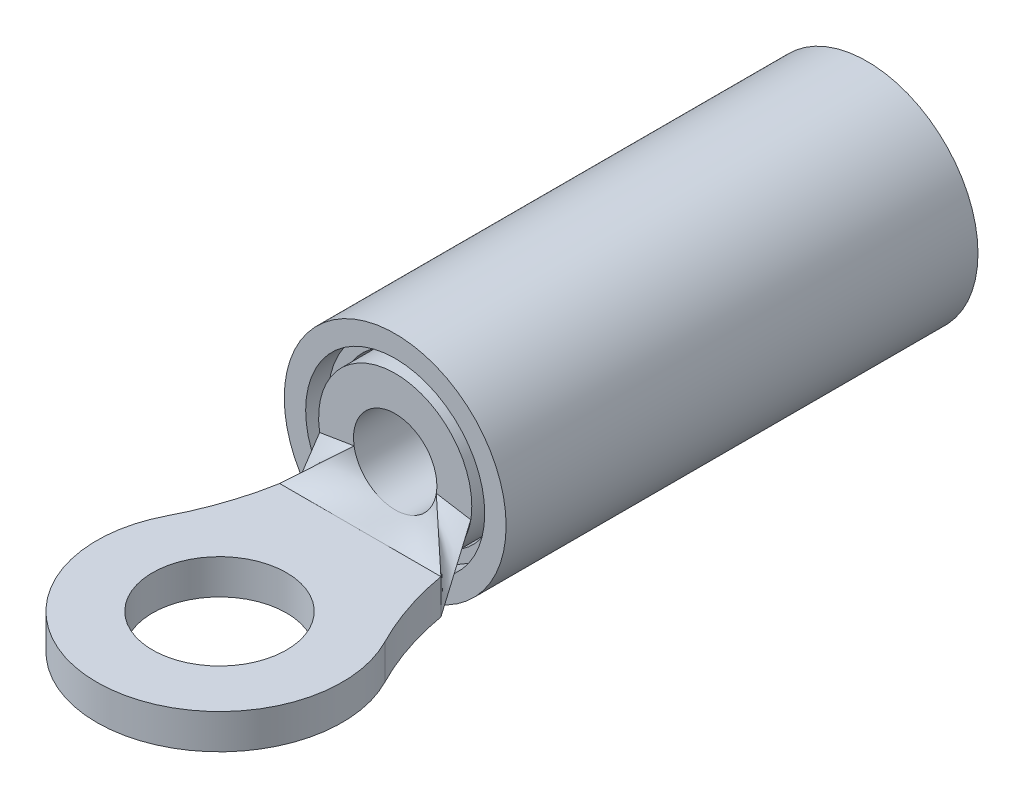
ISO-10303-21;
HEADER;
FILE_DESCRIPTION(('STEP AP214'),'2;1');
FILE_NAME('part.step','',(''),(''),'','','');
FILE_SCHEMA(('AUTOMOTIVE_DESIGN { 1 0 10303 214 1 1 1 1 }'));
ENDSEC;
DATA;
#1=APPLICATION_CONTEXT('core data for automotive mechanical design processes');
#2=APPLICATION_PROTOCOL_DEFINITION('international standard','automotive_design',2000,#1);
#3=PRODUCT_CONTEXT('',#1,'mechanical');
#4=PRODUCT('Part','Part','',(#3));
#5=PRODUCT_RELATED_PRODUCT_CATEGORY('part','',(#4));
#6=PRODUCT_DEFINITION_FORMATION('','',#4);
#7=PRODUCT_DEFINITION_CONTEXT('part definition',#1,'design');
#8=PRODUCT_DEFINITION('design','',#6,#7);
#9=PRODUCT_DEFINITION_SHAPE('','',#8);
#10=(LENGTH_UNIT() NAMED_UNIT(*) SI_UNIT(.MILLI.,.METRE.));
#11=(NAMED_UNIT(*) PLANE_ANGLE_UNIT() SI_UNIT($,.RADIAN.));
#12=(NAMED_UNIT(*) SI_UNIT($,.STERADIAN.) SOLID_ANGLE_UNIT());
#13=UNCERTAINTY_MEASURE_WITH_UNIT(LENGTH_MEASURE(1.E-05),#10,'distance_accuracy_value','');
#14=(GEOMETRIC_REPRESENTATION_CONTEXT(3) GLOBAL_UNCERTAINTY_ASSIGNED_CONTEXT((#13)) GLOBAL_UNIT_ASSIGNED_CONTEXT((#10,
#11,#12)) REPRESENTATION_CONTEXT('',''));
#15=CARTESIAN_POINT('',(0.,0.,0.));
#16=DIRECTION('',(0.,0.,1.));
#17=DIRECTION('',(1.,0.,0.));
#18=AXIS2_PLACEMENT_3D('',#15,#16,#17);
#19=CARTESIAN_POINT('',(0.,1.7272,-8.1026));
#20=DIRECTION('',(0.,0.,-1.));
#21=DIRECTION('',(-1.,0.,0.));
#22=AXIS2_PLACEMENT_3D('',#19,#20,#21);
#23=PLANE('',#22);
#24=CARTESIAN_POINT('',(0.,1.7272,-8.1026));
#25=DIRECTION('',(0.,0.,1.));
#26=DIRECTION('',(1.,0.,0.));
#27=AXIS2_PLACEMENT_3D('',#24,#25,#26);
#28=CIRCLE('',#27,0.9398);
#29=CARTESIAN_POINT('',(0.9398,1.7272,-8.1026));
#30=VERTEX_POINT('',#29);
#31=EDGE_CURVE('E118',#30,#30,#28,.T.);
#32=ORIENTED_EDGE('',*,*,#31,.T.);
#33=EDGE_LOOP('',(#32));
#34=FACE_BOUND('',#33,.T.);
#35=ADVANCED_FACE('F16',(#34),#23,.F.);
#36=CARTESIAN_POINT('',(0.,1.7272,-3.75539));
#37=DIRECTION('',(0.,0.,1.));
#38=DIRECTION('',(1.,0.,0.));
#39=AXIS2_PLACEMENT_3D('',#36,#37,#38);
#40=CYLINDRICAL_SURFACE('',#39,0.9398);
#41=ORIENTED_EDGE('',*,*,#31,.F.);
#42=EDGE_LOOP('',(#41));
#43=FACE_BOUND('',#42,.T.);
#44=CARTESIAN_POINT('',(0.927849603691904,1.57779473306881,-3.96239999999999));
#45=CARTESIAN_POINT('',(0.927688379855311,1.5767962073593,-3.96239999999999));
#46=CARTESIAN_POINT('',(0.892013020871429,1.35816828363591,-3.96239999999999));
#47=CARTESIAN_POINT('',(0.660693798805449,0.949289492115093,-3.96239999999999));
#48=CARTESIAN_POINT('',(0.,0.706455253942457,-3.96239999999999));
#49=CARTESIAN_POINT('',(-0.660693798805449,0.949289492115093,-3.96239999999999));
#50=CARTESIAN_POINT('',(-0.892013020871412,1.35816828363588,-3.96239999999999));
#51=CARTESIAN_POINT('',(-0.927688379855301,1.57679620735924,-3.96239999999999));
#52=CARTESIAN_POINT('',(-0.927849603691889,1.57779473306872,-3.96239999999999));
#53=B_SPLINE_CURVE_WITH_KNOTS('',3,(#44,#45,#46,#47,#48,#49,#50,#51,#52),.UNSPECIFIED.,.F.,.F.,
(4,1,1,1,1,1,4),(-0.00114672630853119,0.,0.250000000000036,0.500000000000036,0.750000000000036,
1.00000000000004,1.00114672630857),.UNSPECIFIED.);
#54=CARTESIAN_POINT('',(0.927360922187214,1.57480000000028,-3.9624));
#55=VERTEX_POINT('',#54);
#56=CARTESIAN_POINT('',(0.,0.787400000000001,-3.9624));
#57=VERTEX_POINT('',#56);
#58=EDGE_CURVE('E126',#55,#57,#53,.T.);
#59=ORIENTED_EDGE('',*,*,#58,.F.);
#60=CARTESIAN_POINT('',(0.,1.7272,-3.9624));
#61=DIRECTION('',(0.,0.,1.));
#62=DIRECTION('',(1.,0.,0.));
#63=AXIS2_PLACEMENT_3D('',#60,#61,#62);
#64=CIRCLE('',#63,0.9398);
#65=CARTESIAN_POINT('',(-0.927360922187283,1.57480000000009,-3.96239999999992));
#66=VERTEX_POINT('',#65);
#67=EDGE_CURVE('E123',#66,#55,#64,.F.);
#68=ORIENTED_EDGE('',*,*,#67,.F.);
#69=CARTESIAN_POINT('',(0.927849603691892,1.57779473306882,-3.9624));
#70=CARTESIAN_POINT('',(0.927688379855299,1.57679620735931,-3.9624));
#71=CARTESIAN_POINT('',(0.89201302087142,1.35816828363592,-3.9624));
#72=CARTESIAN_POINT('',(0.660693798805446,0.949289492115095,-3.9624));
#73=CARTESIAN_POINT('',(0.,0.706455253942456,-3.9624));
#74=CARTESIAN_POINT('',(-0.660693798805446,0.949289492115095,-3.9624));
#75=CARTESIAN_POINT('',(-0.892013020871404,1.35816828363589,-3.9624));
#76=CARTESIAN_POINT('',(-0.927688379855289,1.57679620735925,-3.9624));
#77=CARTESIAN_POINT('',(-0.927849603691877,1.57779473306873,-3.9624));
#78=B_SPLINE_CURVE_WITH_KNOTS('',3,(#69,#70,#71,#72,#73,#74,#75,#76,#77),.UNSPECIFIED.,.F.,.F.,
(4,1,1,1,1,1,4),(-0.00114672630853119,0.,0.250000000000036,0.500000000000036,0.750000000000036,
1.00000000000004,1.00114672630857),.UNSPECIFIED.);
#79=EDGE_CURVE('E226',#57,#66,#78,.T.);
#80=ORIENTED_EDGE('',*,*,#79,.F.);
#81=EDGE_LOOP('',(#59,#68,#80));
#82=FACE_BOUND('',#81,.T.);
#83=ADVANCED_FACE('F253',(#43,#82),#40,.F.);
#84=CARTESIAN_POINT('',(-1.82360988331871,0.786493633565488,-3.17409706770464));
#85=CARTESIAN_POINT('',(-1.52481400115551,1.05044540220337,-3.43704874732687));
#86=CARTESIAN_POINT('',(-1.2260181189923,1.31439717084039,-3.70000042695));
#87=CARTESIAN_POINT('',(-0.927222236829129,1.57834893947816,-3.96295210657224));
#88=CARTESIAN_POINT('',(-1.82221832573738,0.786494778601189,-3.17409706770464));
#89=CARTESIAN_POINT('',(-1.52383284205352,1.05011309027634,-3.43704874732687));
#90=CARTESIAN_POINT('',(-1.22544735836966,1.31373140195064,-3.70000042695));
#91=CARTESIAN_POINT('',(-0.92706187468583,1.57734971362567,-3.96295210657224));
#92=CARTESIAN_POINT('',(-1.5174510522353,0.786745484993033,-3.17409706770464));
#93=CARTESIAN_POINT('',(-1.30882569501637,0.977353154357277,-3.43704874732687));
#94=CARTESIAN_POINT('',(-1.10020033779743,1.16796082372152,-3.70000042695));
#95=CARTESIAN_POINT('',(-0.891574980578142,1.35856849308549,-3.96295210657224));
#96=CARTESIAN_POINT('',(-0.909491687782543,0.787214357060318,-3.17409706770464));
#97=CARTESIAN_POINT('',(-0.826500974298133,0.841277239794508,-3.43704874732687));
#98=CARTESIAN_POINT('',(-0.743510260813634,0.895340122528698,-3.70000042695));
#99=CARTESIAN_POINT('',(-0.660519547329224,0.949403005262888,-3.96295210657224));
#100=CARTESIAN_POINT('',(0.,0.787492821469888,-3.17409706770464));
#101=CARTESIAN_POINT('',(0.,0.760461380102748,-3.43704874732687));
#102=CARTESIAN_POINT('',(0.,0.733429938735698,-3.70000042695));
#103=CARTESIAN_POINT('',(0.,0.706398497368559,-3.96295210657224));
#104=CARTESIAN_POINT('',(0.909491687782543,0.787214357060318,-3.17409706770464));
#105=CARTESIAN_POINT('',(0.826500974298133,0.841277239794508,-3.43704874732687));
#106=CARTESIAN_POINT('',(0.743510260813634,0.895340122528698,-3.70000042695));
#107=CARTESIAN_POINT('',(0.660519547329224,0.949403005262888,-3.96295210657224));
#108=CARTESIAN_POINT('',(1.51745105223535,0.786745484993033,-3.17409706770464));
#109=CARTESIAN_POINT('',(1.30882569501641,0.977353154357287,-3.43704874732687));
#110=CARTESIAN_POINT('',(1.10020033779746,1.16796082372153,-3.70000042695));
#111=CARTESIAN_POINT('',(0.891574980578158,1.35856849308552,-3.96295210657224));
#112=CARTESIAN_POINT('',(1.82221832573746,0.786494778601189,-3.17409706770464));
#113=CARTESIAN_POINT('',(1.52383284205358,1.05011309027636,-3.43704874732687));
#114=CARTESIAN_POINT('',(1.22544735836969,1.31373140195068,-3.70000042695));
#115=CARTESIAN_POINT('',(0.927061874685841,1.57734971362574,-3.96295210657224));
#116=CARTESIAN_POINT('',(1.82360988331884,0.786493633565488,-3.17409706770464));
#117=CARTESIAN_POINT('',(1.5248140011556,1.0504454022034,-3.43704874732687));
#118=CARTESIAN_POINT('',(1.22601811899235,1.31439717084046,-3.70000042695));
#119=CARTESIAN_POINT('',(0.927222236829145,1.57834893947825,-3.96295210657224));
#120=B_SPLINE_SURFACE_WITH_KNOTS('',3,3,((#84,#85,#86,#87),(#88,#89,#90,#91),(#92,#93,#94,#95),
(#96,#97,#98,#99),(#100,#101,#102,#103),(#104,#105,#106,#107),(#108,#109,#110,#111),(#112,#113,
#114,#115),(#116,#117,#118,#119)),.UNSPECIFIED.,.F.,.F.,.F.,(4,1,1,1,1,1,4),(4,4),
(-0.0011467263085312,0.,0.25,0.5,0.75,1.,1.00114672630857),(-0.00114672630853697,
1.00070117674907),.UNSPECIFIED.);
#121=DIRECTION('',(-0.624785295765188,-0.552106572229049,0.552106572227768));
#122=VECTOR('',#121,1.);
#123=CARTESIAN_POINT('',(-1.37308567660576,1.18092458713851,-3.56852458713844));
#124=LINE('',#123,#122);
#125=CARTESIAN_POINT('',(-1.81841342297472,0.7874,-3.1750000000004));
#126=VERTEX_POINT('',#125);
#127=EDGE_CURVE('E80',#66,#126,#124,.T.);
#128=DIRECTION('',(1.,0.,0.));
#129=VECTOR('',#128,1.);
#130=CARTESIAN_POINT('',(0.,0.7874,-3.175));
#131=LINE('',#130,#129);
#132=CARTESIAN_POINT('',(1.81841342297489,0.787399999999682,-3.17500000000051));
#133=VERTEX_POINT('',#132);
#134=EDGE_CURVE('E93',#133,#126,#131,.F.);
#135=DIRECTION('',(-0.624785295765167,0.552106572229033,-0.552106572227808));
#136=VECTOR('',#135,1.);
#137=CARTESIAN_POINT('',(1.3730856766057,1.18092458713847,-3.56852458713844));
#138=LINE('',#137,#136);
#139=EDGE_CURVE('E122',#133,#55,#138,.T.);
#140=ORIENTED_EDGE('',*,*,#79,.T.);
#141=ORIENTED_EDGE('',*,*,#127,.T.);
#142=ORIENTED_EDGE('',*,*,#134,.F.);
#143=ORIENTED_EDGE('',*,*,#139,.T.);
#144=ORIENTED_EDGE('',*,*,#58,.T.);
#145=EDGE_LOOP('',(#140,#141,#142,#143,#144));
#146=FACE_BOUND('',#145,.T.);
#147=ADVANCED_FACE('F241',(#146),#120,.T.);
#148=CARTESIAN_POINT('',(0.,0.7874,0.));
#149=DIRECTION('',(0.,1.,0.));
#150=DIRECTION('',(0.,0.,1.));
#151=AXIS2_PLACEMENT_3D('',#148,#149,#150);
#152=PLANE('',#151);
#153=CARTESIAN_POINT('',(0.,0.7874,0.));
#154=DIRECTION('',(0.,-1.,0.));
#155=DIRECTION('',(0.,0.,-1.));
#156=AXIS2_PLACEMENT_3D('',#153,#154,#155);
#157=CIRCLE('',#156,1.5113);
#158=CARTESIAN_POINT('',(0.,0.7874,-1.5113));
#159=VERTEX_POINT('',#158);
#160=EDGE_CURVE('E215',#159,#159,#157,.T.);
#161=ORIENTED_EDGE('',*,*,#160,.T.);
#162=EDGE_LOOP('',(#161));
#163=FACE_BOUND('',#162,.T.);
#164=CARTESIAN_POINT('',(0.,0.7874,0.));
#165=DIRECTION('',(0.,-1.,0.));
#166=DIRECTION('',(0.,0.,-1.));
#167=AXIS2_PLACEMENT_3D('',#164,#165,#166);
#168=CIRCLE('',#167,2.7686);
#169=CARTESIAN_POINT('',(2.46118425365068,0.7874,-1.26795821286875));
#170=VERTEX_POINT('',#169);
#171=CARTESIAN_POINT('',(-2.46118425365068,0.7874,-1.26795821286875));
#172=VERTEX_POINT('',#171);
#173=EDGE_CURVE('E91',#170,#172,#168,.T.);
#174=ORIENTED_EDGE('',*,*,#173,.F.);
#175=CARTESIAN_POINT('',(8.422217675337,0.7874,-4.338976269725));
#176=DIRECTION('',(0.,-1.,0.));
#177=DIRECTION('',(0.,0.,-1.));
#178=AXIS2_PLACEMENT_3D('',#175,#176,#177);
#179=CIRCLE('',#178,6.7056);
#180=EDGE_CURVE('E115',#170,#133,#179,.T.);
#181=ORIENTED_EDGE('',*,*,#180,.T.);
#182=ORIENTED_EDGE('',*,*,#134,.T.);
#183=CARTESIAN_POINT('',(-8.422217675337,0.7874,-4.338976269725));
#184=DIRECTION('',(0.,-1.,0.));
#185=DIRECTION('',(0.,0.,-1.));
#186=AXIS2_PLACEMENT_3D('',#183,#184,#185);
#187=CIRCLE('',#186,6.7056);
#188=EDGE_CURVE('E86',#126,#172,#187,.T.);
#189=ORIENTED_EDGE('',*,*,#188,.T.);
#190=EDGE_LOOP('',(#174,#181,#182,#189));
#191=FACE_BOUND('',#190,.T.);
#192=ADVANCED_FACE('F88',(#163,#191),#152,.T.);
#193=CARTESIAN_POINT('',(-8.422217675337,0.,-4.338976269725));
#194=DIRECTION('',(0.,-1.,0.));
#195=DIRECTION('',(0.,0.,-1.));
#196=AXIS2_PLACEMENT_3D('',#193,#194,#195);
#197=CYLINDRICAL_SURFACE('',#196,6.7056);
#198=DIRECTION('',(0.,-1.,0.));
#199=VECTOR('',#198,1.);
#200=CARTESIAN_POINT('',(-2.46118425365075,0.,-1.26795821286887));
#201=LINE('',#200,#199);
#202=CARTESIAN_POINT('',(-2.46118425365068,0.,-1.26795821286875));
#203=VERTEX_POINT('',#202);
#204=EDGE_CURVE('E99',#172,#203,#201,.T.);
#205=ORIENTED_EDGE('',*,*,#204,.F.);
#206=ORIENTED_EDGE('',*,*,#188,.F.);
#207=DIRECTION('',(0.,-1.,0.));
#208=VECTOR('',#207,1.);
#209=CARTESIAN_POINT('',(-1.81841342297481,0.,-3.17499999999997));
#210=LINE('',#209,#208);
#211=CARTESIAN_POINT('',(-1.81841342297487,-2.92472398563232E-13,-3.17499999999999));
#212=VERTEX_POINT('',#211);
#213=EDGE_CURVE('E96',#212,#126,#210,.F.);
#214=ORIENTED_EDGE('',*,*,#213,.F.);
#215=CARTESIAN_POINT('',(-8.422217675337,0.,-4.338976269725));
#216=DIRECTION('',(0.,-1.,0.));
#217=DIRECTION('',(0.,0.,-1.));
#218=AXIS2_PLACEMENT_3D('',#215,#216,#217);
#219=CIRCLE('',#218,6.7056);
#220=EDGE_CURVE('E102',#212,#203,#219,.T.);
#221=ORIENTED_EDGE('',*,*,#220,.T.);
#222=EDGE_LOOP('',(#205,#206,#214,#221));
#223=FACE_BOUND('',#222,.T.);
#224=ADVANCED_FACE('F100',(#223),#197,.F.);
#225=CARTESIAN_POINT('',(0.,0.,0.));
#226=DIRECTION('',(0.,-1.,0.));
#227=DIRECTION('',(0.,0.,-1.));
#228=AXIS2_PLACEMENT_3D('',#225,#226,#227);
#229=CYLINDRICAL_SURFACE('',#228,2.7686);
#230=ORIENTED_EDGE('',*,*,#204,.T.);
#231=CARTESIAN_POINT('',(0.,0.,0.));
#232=DIRECTION('',(0.,-1.,0.));
#233=DIRECTION('',(0.,0.,-1.));
#234=AXIS2_PLACEMENT_3D('',#231,#232,#233);
#235=CIRCLE('',#234,2.7686);
#236=CARTESIAN_POINT('',(2.46118425365068,0.,-1.26795821286875));
#237=VERTEX_POINT('',#236);
#238=EDGE_CURVE('E315',#203,#237,#235,.F.);
#239=ORIENTED_EDGE('',*,*,#238,.T.);
#240=DIRECTION('',(0.,-1.,0.));
#241=VECTOR('',#240,1.);
#242=CARTESIAN_POINT('',(2.46118425365054,0.,-1.26795821286877));
#243=LINE('',#242,#241);
#244=EDGE_CURVE('E106',#237,#170,#243,.F.);
#245=ORIENTED_EDGE('',*,*,#244,.T.);
#246=ORIENTED_EDGE('',*,*,#173,.T.);
#247=EDGE_LOOP('',(#230,#239,#245,#246));
#248=FACE_BOUND('',#247,.T.);
#249=ADVANCED_FACE('F108',(#248),#229,.T.);
#250=CARTESIAN_POINT('',(8.422217675337,0.,-4.338976269725));
#251=DIRECTION('',(0.,-1.,0.));
#252=DIRECTION('',(0.,0.,-1.));
#253=AXIS2_PLACEMENT_3D('',#250,#251,#252);
#254=CYLINDRICAL_SURFACE('',#253,6.7056);
#255=ORIENTED_EDGE('',*,*,#244,.F.);
#256=CARTESIAN_POINT('',(8.422217675337,0.,-4.338976269725));
#257=DIRECTION('',(0.,-1.,0.));
#258=DIRECTION('',(0.,0.,-1.));
#259=AXIS2_PLACEMENT_3D('',#256,#257,#258);
#260=CIRCLE('',#259,6.7056);
#261=CARTESIAN_POINT('',(1.81841342296967,0.,-3.17500000000012));
#262=VERTEX_POINT('',#261);
#263=EDGE_CURVE('E312',#237,#262,#260,.T.);
#264=ORIENTED_EDGE('',*,*,#263,.T.);
#265=DIRECTION('',(-4.95883766769503E-13,-1.,0.));
#266=VECTOR('',#265,1.);
#267=CARTESIAN_POINT('',(1.81841342297503,0.393700000000314,-3.17500000000017));
#268=LINE('',#267,#266);
#269=EDGE_CURVE('E212',#133,#262,#268,.T.);
#270=ORIENTED_EDGE('',*,*,#269,.F.);
#271=ORIENTED_EDGE('',*,*,#180,.F.);
#272=EDGE_LOOP('',(#255,#264,#270,#271));
#273=FACE_BOUND('',#272,.T.);
#274=ADVANCED_FACE('F326',(#273),#254,.F.);
#275=CARTESIAN_POINT('',(0.,0.,0.));
#276=DIRECTION('',(0.,-1.,0.));
#277=DIRECTION('',(0.,0.,-1.));
#278=AXIS2_PLACEMENT_3D('',#275,#276,#277);
#279=CYLINDRICAL_SURFACE('',#278,1.5113);
#280=CARTESIAN_POINT('',(0.,0.,0.));
#281=DIRECTION('',(0.,-1.,0.));
#282=DIRECTION('',(0.,0.,-1.));
#283=AXIS2_PLACEMENT_3D('',#280,#281,#282);
#284=CIRCLE('',#283,1.5113);
#285=CARTESIAN_POINT('',(0.,0.,-1.5113));
#286=VERTEX_POINT('',#285);
#287=EDGE_CURVE('E191',#286,#286,#284,.T.);
#288=ORIENTED_EDGE('',*,*,#287,.T.);
#289=EDGE_LOOP('',(#288));
#290=FACE_BOUND('',#289,.T.);
#291=ORIENTED_EDGE('',*,*,#160,.F.);
#292=EDGE_LOOP('',(#291));
#293=FACE_BOUND('',#292,.T.);
#294=ADVANCED_FACE('F408',(#290,#293),#279,.F.);
#295=CARTESIAN_POINT('',(1.81990011146723,0.787401831166442,-3.17368815769524));
#296=CARTESIAN_POINT('',(1.52145999256997,1.0503754682189,-3.43702938589816));
#297=CARTESIAN_POINT('',(1.22301987367187,1.31334910527118,-3.70037061410197));
#298=CARTESIAN_POINT('',(0.924579754774749,1.5763227423226,-3.96371184230489));
#299=CARTESIAN_POINT('',(1.81989939258135,0.786963940009372,-3.17368815769524));
#300=CARTESIAN_POINT('',(1.52160358393252,1.05006010744551,-3.43702938589816));
#301=CARTESIAN_POINT('',(1.22330777528283,1.31315627488146,-3.70037061410197));
#302=CARTESIAN_POINT('',(0.92501196663413,1.57625244231656,-3.96371184230489));
#303=CARTESIAN_POINT('',(1.81946718072199,0.523693011812293,-3.17368815769524));
#304=CARTESIAN_POINT('',(1.60793424096355,0.860457458048874,-3.43702938589815));
#305=CARTESIAN_POINT('',(1.39640130120513,1.19722190428554,-3.70037061410197));
#306=CARTESIAN_POINT('',(1.1848683614476,1.53398635052249,-3.96371184230489));
#307=CARTESIAN_POINT('',(1.81903424997628,0.259984192458127,-3.17368815769524));
#308=CARTESIAN_POINT('',(1.69440848935747,0.670539447879218,-3.43702938589815));
#309=CARTESIAN_POINT('',(1.56978272873867,1.08109470329988,-3.70037061410197));
#310=CARTESIAN_POINT('',(1.44515696811989,1.49164995872125,-3.96371184230489));
#311=CARTESIAN_POINT('',(1.81860203811696,-0.00328673573900867,-3.17368815769524));
#312=CARTESIAN_POINT('',(1.78073914638939,0.480936798482901,-3.43702938589815));
#313=CARTESIAN_POINT('',(1.74287625466096,0.96516033270468,-3.70037061410197));
#314=CARTESIAN_POINT('',(1.70501336293251,1.44938386692632,-3.96371184230489));
#315=CARTESIAN_POINT('',(1.81860131923109,-0.00372462689607972,-3.17368815769524));
#316=CARTESIAN_POINT('',(1.78088273775194,0.480621437709509,-3.43702938589815));
#317=CARTESIAN_POINT('',(1.74316415627192,0.964967502314968,-3.70037061410197));
#318=CARTESIAN_POINT('',(1.70544557479189,1.44931356692029,-3.96371184230489));
#319=B_SPLINE_SURFACE_WITH_KNOTS('',3,3,((#295,#296,#297,#298),(#299,#300,#301,#302),(#303,#304,
#305,#306),(#307,#308,#309,#310),(#311,#312,#313,#314),(#315,#316,#317,#318)),.UNSPECIFIED.,.F.,
.F.,.F.,(4,1,1,4),(4,4),(-0.00166604305913106,0.,1.,1.00166604305913),(-0.00166604305911288,
1.00166604305927),.UNSPECIFIED.);
#320=DIRECTION('',(-0.986764122349887,0.162162162180511,0.));
#321=VECTOR('',#320,1.);
#322=CARTESIAN_POINT('',(1.704338992126,1.447113513499,-3.9624));
#323=LINE('',#322,#321);
#324=CARTESIAN_POINT('',(1.70433899212584,1.44711351349907,-3.96239999999991));
#325=VERTEX_POINT('',#324);
#326=EDGE_CURVE('E180',#325,#55,#323,.T.);
#327=DIRECTION('',(0.0690770618489083,-0.876290584485796,0.476805170974334));
#328=VECTOR('',#327,1.);
#329=CARTESIAN_POINT('',(1.76139728528677,0.723289370935068,-3.56855451065966));
#330=LINE('',#329,#328);
#331=EDGE_CURVE('E41',#325,#262,#330,.T.);
#332=ORIENTED_EDGE('',*,*,#326,.T.);
#333=ORIENTED_EDGE('',*,*,#139,.F.);
#334=ORIENTED_EDGE('',*,*,#269,.T.);
#335=ORIENTED_EDGE('',*,*,#331,.F.);
#336=EDGE_LOOP('',(#332,#333,#334,#335));
#337=FACE_BOUND('',#336,.T.);
#338=ADVANCED_FACE('F254',(#337),#319,.T.);
#339=CARTESIAN_POINT('',(0.,0.,0.));
#340=DIRECTION('',(0.,1.,0.));
#341=DIRECTION('',(0.,0.,1.));
#342=AXIS2_PLACEMENT_3D('',#339,#340,#341);
#343=PLANE('',#342);
#344=ORIENTED_EDGE('',*,*,#287,.F.);
#345=EDGE_LOOP('',(#344));
#346=FACE_BOUND('',#345,.T.);
#347=ORIENTED_EDGE('',*,*,#263,.F.);
#348=ORIENTED_EDGE('',*,*,#238,.F.);
#349=ORIENTED_EDGE('',*,*,#220,.F.);
#350=DIRECTION('',(-1.,0.,0.));
#351=VECTOR('',#350,1.);
#352=CARTESIAN_POINT('',(0.,0.,-3.17499999999999));
#353=LINE('',#352,#351);
#354=EDGE_CURVE('E179',#262,#212,#353,.T.);
#355=ORIENTED_EDGE('',*,*,#354,.F.);
#356=EDGE_LOOP('',(#347,#348,#349,#355));
#357=FACE_BOUND('',#356,.T.);
#358=ADVANCED_FACE('F331',(#346,#357),#343,.F.);
#359=CARTESIAN_POINT('',(-1.81860131923109,-0.00372462689615094,-3.17368815769524));
#360=CARTESIAN_POINT('',(-1.78088273775196,0.480621437709458,-3.43702938589816));
#361=CARTESIAN_POINT('',(-1.74316415627197,0.964967502314937,-3.70037061410197));
#362=CARTESIAN_POINT('',(-1.70544557479196,1.44931356692028,-3.96371184230489));
#363=CARTESIAN_POINT('',(-1.81860203811696,-0.00328673573907987,-3.17368815769524));
#364=CARTESIAN_POINT('',(-1.78073914638942,0.48093679848285,-3.43702938589816));
#365=CARTESIAN_POINT('',(-1.74287625466101,0.965160332704649,-3.70037061410197));
#366=CARTESIAN_POINT('',(-1.70501336293258,1.44938386692631,-3.96371184230489));
#367=CARTESIAN_POINT('',(-1.81903424997628,0.259984192458091,-3.17368815769524));
#368=CARTESIAN_POINT('',(-1.69440848935749,0.670539447879192,-3.43702938589816));
#369=CARTESIAN_POINT('',(-1.56978272873869,1.08109470329986,-3.70037061410197));
#370=CARTESIAN_POINT('',(-1.44515696811992,1.49164995872125,-3.96371184230489));
#371=CARTESIAN_POINT('',(-1.81946718072199,0.523693011812257,-3.17368815769524));
#372=CARTESIAN_POINT('',(-1.60793424096356,0.860457458048848,-3.43702938589816));
#373=CARTESIAN_POINT('',(-1.39640130120515,1.19722190428552,-3.70037061410197));
#374=CARTESIAN_POINT('',(-1.18486836144763,1.53398635052248,-3.96371184230489));
#375=CARTESIAN_POINT('',(-1.81989939258135,0.7869639400093,-3.17368815769524));
#376=CARTESIAN_POINT('',(-1.52160358393254,1.05006010744546,-3.43702938589816));
#377=CARTESIAN_POINT('',(-1.22330777528288,1.31315627488143,-3.70037061410197));
#378=CARTESIAN_POINT('',(-0.9250119666342,1.57625244231655,-3.96371184230489));
#379=CARTESIAN_POINT('',(-1.81990011146723,0.787401831166371,-3.17368815769524));
#380=CARTESIAN_POINT('',(-1.52145999257,1.05037546821885,-3.43702938589816));
#381=CARTESIAN_POINT('',(-1.22301987367191,1.31334910527115,-3.70037061410197));
#382=CARTESIAN_POINT('',(-0.924579754774819,1.57632274232258,-3.96371184230489));
#383=B_SPLINE_SURFACE_WITH_KNOTS('',3,3,((#359,#360,#361,#362),(#363,#364,#365,#366),(#367,#368,
#369,#370),(#371,#372,#373,#374),(#375,#376,#377,#378),(#379,#380,#381,#382)),.UNSPECIFIED.,.F.,
.F.,.F.,(4,1,1,4),(4,4),(-0.00166604305913136,0.,1.,1.00166604305913),(-0.00166604305911261,
1.00166604305927),.UNSPECIFIED.);
#384=DIRECTION('',(-0.986764122349887,-0.162162162180511,0.));
#385=VECTOR('',#384,1.);
#386=CARTESIAN_POINT('',(-0.9273609221873,1.5748,-3.9624));
#387=LINE('',#386,#385);
#388=CARTESIAN_POINT('',(-1.70433899212656,1.44711351350252,-3.96239999999957));
#389=VERTEX_POINT('',#388);
#390=EDGE_CURVE('E185',#66,#389,#387,.T.);
#391=DIRECTION('',(0.0690770618533543,0.876290584487443,-0.476805170970664));
#392=VECTOR('',#391,1.);
#393=CARTESIAN_POINT('',(-1.76139728529317,0.723289370941997,-3.56855451065966));
#394=LINE('',#393,#392);
#395=EDGE_CURVE('E199',#212,#389,#394,.T.);
#396=ORIENTED_EDGE('',*,*,#213,.T.);
#397=ORIENTED_EDGE('',*,*,#127,.F.);
#398=ORIENTED_EDGE('',*,*,#390,.T.);
#399=ORIENTED_EDGE('',*,*,#395,.F.);
#400=EDGE_LOOP('',(#396,#397,#398,#399));
#401=FACE_BOUND('',#400,.T.);
#402=ADVANCED_FACE('F338',(#401),#383,.T.);
#403=CARTESIAN_POINT('',(0.,1.7272,-3.9624));
#404=DIRECTION('',(0.,0.,-1.));
#405=DIRECTION('',(-1.,0.,0.));
#406=AXIS2_PLACEMENT_3D('',#403,#404,#405);
#407=PLANE('',#406);
#408=ORIENTED_EDGE('',*,*,#67,.T.);
#409=ORIENTED_EDGE('',*,*,#326,.F.);
#410=CARTESIAN_POINT('',(0.,1.7272,-3.9624));
#411=DIRECTION('',(0.,0.,1.));
#412=DIRECTION('',(1.,0.,0.));
#413=AXIS2_PLACEMENT_3D('',#410,#411,#412);
#414=CIRCLE('',#413,1.7272);
#415=EDGE_CURVE('E304',#389,#325,#414,.F.);
#416=ORIENTED_EDGE('',*,*,#415,.F.);
#417=ORIENTED_EDGE('',*,*,#390,.F.);
#418=EDGE_LOOP('',(#408,#409,#416,#417));
#419=FACE_BOUND('',#418,.T.);
#420=ADVANCED_FACE('F152',(#419),#407,.F.);
#421=CARTESIAN_POINT('',(1.8225287250347,-0.00159214539115016,-3.17413682371266));
#422=CARTESIAN_POINT('',(1.78339011282223,0.483415233122423,-3.4370819483437));
#423=CARTESIAN_POINT('',(1.74425150060976,0.9684226116362,-3.70002707297562));
#424=CARTESIAN_POINT('',(1.70511288839729,1.45342999014921,-3.96297219760666));
#425=CARTESIAN_POINT('',(1.82119863877089,-0.00159022240642737,-3.17413682371266));
#426=CARTESIAN_POINT('',(1.7824091264583,0.482831366778789,-3.4370819483437));
#427=CARTESIAN_POINT('',(1.74361961414571,0.967252955964208,-3.70002707297562));
#428=CARTESIAN_POINT('',(1.70483010183313,1.45167454514887,-3.96297219760666));
#429=CARTESIAN_POINT('',(1.51653900490134,-0.0011498783121246,-3.17413682371266));
#430=CARTESIAN_POINT('',(1.55749721752876,0.349131866603996,-3.4370819483437));
#431=CARTESIAN_POINT('',(1.59845543015617,0.699413611520157,-3.70002707297562));
#432=CARTESIAN_POINT('',(1.63941364278358,1.04969535643649,-3.96297219760665));
#433=CARTESIAN_POINT('',(1.06045703307379,-0.000533079014132597,-3.17413682371266));
#434=CARTESIAN_POINT('',(1.14701025032756,0.161856145375596,-3.4370819483437));
#435=CARTESIAN_POINT('',(1.23356346758133,0.32424536976535,-3.70002707297562));
#436=CARTESIAN_POINT('',(1.32011668483509,0.486634594155014,-3.96297219760665));
#437=CARTESIAN_POINT('',(0.454435499099208,-7.9113831899394E-05,-3.17413682371266));
#438=CARTESIAN_POINT('',(0.505568838817562,0.0240209416197948,-3.4370819483437));
#439=CARTESIAN_POINT('',(0.556702178535915,0.0481209970714783,-3.70002707297562));
#440=CARTESIAN_POINT('',(0.607835518254268,0.0722210525231707,-3.96297219760665));
#441=CARTESIAN_POINT('',(0.,3.95569159501442E-05,-3.17413682371266));
#442=CARTESIAN_POINT('',(0.,-0.0120104708098928,-3.4370819483437));
#443=CARTESIAN_POINT('',(0.,-0.0240604985357437,-3.70002707297562));
#444=CARTESIAN_POINT('',(0.,-0.0361105262615856,-3.96297219760665));
#445=CARTESIAN_POINT('',(-0.454435499099208,-7.9113831899394E-05,-3.17413682371266));
#446=CARTESIAN_POINT('',(-0.505568838817562,0.0240209416197948,-3.4370819483437));
#447=CARTESIAN_POINT('',(-0.556702178535915,0.0481209970714783,-3.70002707297562));
#448=CARTESIAN_POINT('',(-0.607835518254268,0.0722210525231707,-3.96297219760665));
#449=CARTESIAN_POINT('',(-1.06045703307379,-0.000533079014132597,-3.17413682371266));
#450=CARTESIAN_POINT('',(-1.14701025032756,0.161856145375596,-3.4370819483437));
#451=CARTESIAN_POINT('',(-1.23356346758133,0.32424536976535,-3.70002707297562));
#452=CARTESIAN_POINT('',(-1.32011668483509,0.486634594155014,-3.96297219760665));
#453=CARTESIAN_POINT('',(-1.51653900490139,-0.00114987831212467,-3.17413682371266));
#454=CARTESIAN_POINT('',(-1.5574972175288,0.349131866604019,-3.4370819483437));
#455=CARTESIAN_POINT('',(-1.59845543015621,0.699413611520201,-3.70002707297562));
#456=CARTESIAN_POINT('',(-1.63941364278362,1.04969535643655,-3.96297219760665));
#457=CARTESIAN_POINT('',(-1.821198638771,-0.00159022240642752,-3.17413682371266));
#458=CARTESIAN_POINT('',(-1.78240912645838,0.482831366778836,-3.4370819483437));
#459=CARTESIAN_POINT('',(-1.74361961414576,0.967252955964303,-3.70002707297562));
#460=CARTESIAN_POINT('',(-1.70483010183315,1.45167454514901,-3.96297219760665));
#461=CARTESIAN_POINT('',(-1.82252872503486,-0.0015921453911504,-3.17413682371266));
#462=CARTESIAN_POINT('',(-1.78339011282235,0.483415233122494,-3.4370819483437));
#463=CARTESIAN_POINT('',(-1.74425150060983,0.968422611636342,-3.70002707297562));
#464=CARTESIAN_POINT('',(-1.70511288839732,1.45342999014943,-3.96297219760665));
#465=B_SPLINE_SURFACE_WITH_KNOTS('',3,3,((#421,#422,#423,#424),(#425,#426,#427,#428),(#429,#430,
#431,#432),(#433,#434,#435,#436),(#437,#438,#439,#440),(#441,#442,#443,#444),(#445,#446,#447,
#448),(#449,#450,#451,#452),(#453,#454,#455,#456),(#457,#458,#459,#460),(#461,#462,#463,#464)),
.UNSPECIFIED.,.F.,.F.,.F.,(4,1,1,1,1,1,1,1,4),(4,4),(-0.00109623607732736,0.,0.25,0.375,0.5,
0.625,0.75,1.,1.00109623607737),(-0.00109623607736888,1.00072669241381),.UNSPECIFIED.);
#466=CARTESIAN_POINT('',(-1.70519805833636,1.45237456057419,-3.96239999999999));
#467=CARTESIAN_POINT('',(-1.70491451209229,1.45062039031599,-3.96239999999999));
#468=CARTESIAN_POINT('',(-1.63932451319329,1.04893310470673,-3.96239999999999));
#469=CARTESIAN_POINT('',(-1.31992833548338,0.486281217283418,-3.96239999999999));
#470=CARTESIAN_POINT('',(-0.607724246464579,0.072168608143115,-3.96239999999999));
#471=CARTESIAN_POINT('',(0.,-0.0360843040715578,-3.96239999999999));
#472=CARTESIAN_POINT('',(0.607724246464579,0.072168608143115,-3.96239999999999));
#473=CARTESIAN_POINT('',(1.31992833548338,0.486281217283418,-3.96239999999999));
#474=CARTESIAN_POINT('',(1.63932451319325,1.04893310470666,-3.96239999999999));
#475=CARTESIAN_POINT('',(1.70491451209226,1.45062039031585,-3.96239999999999));
#476=CARTESIAN_POINT('',(1.70519805833633,1.45237456057398,-3.96239999999999));
#477=B_SPLINE_CURVE_WITH_KNOTS('',3,(#466,#467,#468,#469,#470,#471,#472,#473,#474,#475,#476),
.UNSPECIFIED.,.F.,.F.,(4,1,1,1,1,1,1,1,4),(-0.00109623607732745,0.,0.250000000000044,
0.375000000000044,0.500000000000044,0.625000000000044,0.750000000000044,1.00000000000004,
1.00109623607737),.UNSPECIFIED.);
#478=CARTESIAN_POINT('',(0.,0.,-3.9624));
#479=VERTEX_POINT('',#478);
#480=EDGE_CURVE('E134',#479,#389,#477,.F.);
#481=CARTESIAN_POINT('',(-1.70519805833636,1.45237456057421,-3.9624));
#482=CARTESIAN_POINT('',(-1.70491451209229,1.45062039031601,-3.9624));
#483=CARTESIAN_POINT('',(-1.63932451319329,1.04893310470674,-3.9624));
#484=CARTESIAN_POINT('',(-1.31992833548338,0.486281217283423,-3.9624));
#485=CARTESIAN_POINT('',(-0.607724246464581,0.0721686081431159,-3.9624));
#486=CARTESIAN_POINT('',(0.,-0.0360843040715582,-3.9624));
#487=CARTESIAN_POINT('',(0.607724246464581,0.0721686081431159,-3.9624));
#488=CARTESIAN_POINT('',(1.31992833548338,0.486281217283423,-3.9624));
#489=CARTESIAN_POINT('',(1.63932451319325,1.04893310470667,-3.9624));
#490=CARTESIAN_POINT('',(1.70491451209226,1.45062039031587,-3.9624));
#491=CARTESIAN_POINT('',(1.70519805833633,1.452374560574,-3.9624));
#492=B_SPLINE_CURVE_WITH_KNOTS('',3,(#481,#482,#483,#484,#485,#486,#487,#488,#489,#490,#491),
.UNSPECIFIED.,.F.,.F.,(4,1,1,1,1,1,1,1,4),(-0.00109623607732745,0.,0.250000000000044,
0.375000000000044,0.500000000000044,0.625000000000044,0.750000000000044,1.00000000000004,
1.00109623607737),.UNSPECIFIED.);
#493=EDGE_CURVE('E168',#325,#479,#492,.F.);
#494=ORIENTED_EDGE('',*,*,#395,.T.);
#495=ORIENTED_EDGE('',*,*,#480,.F.);
#496=ORIENTED_EDGE('',*,*,#493,.F.);
#497=ORIENTED_EDGE('',*,*,#331,.T.);
#498=ORIENTED_EDGE('',*,*,#354,.T.);
#499=EDGE_LOOP('',(#494,#495,#496,#497,#498));
#500=FACE_BOUND('',#499,.T.);
#501=ADVANCED_FACE('F18',(#500),#465,.T.);
#502=CARTESIAN_POINT('',(0.,1.7272,-3.75539));
#503=DIRECTION('',(0.,0.,1.));
#504=DIRECTION('',(1.,0.,0.));
#505=AXIS2_PLACEMENT_3D('',#502,#503,#504);
#506=CYLINDRICAL_SURFACE('',#505,1.7272);
#507=CARTESIAN_POINT('',(0.,1.7272,-8.1026));
#508=DIRECTION('',(0.,0.,1.));
#509=DIRECTION('',(1.,0.,0.));
#510=AXIS2_PLACEMENT_3D('',#507,#508,#509);
#511=CIRCLE('',#510,1.7272);
#512=CARTESIAN_POINT('',(1.7272,1.7272,-8.1026));
#513=VERTEX_POINT('',#512);
#514=EDGE_CURVE('E300',#513,#513,#511,.T.);
#515=ORIENTED_EDGE('',*,*,#514,.T.);
#516=EDGE_LOOP('',(#515));
#517=FACE_BOUND('',#516,.T.);
#518=ORIENTED_EDGE('',*,*,#415,.T.);
#519=ORIENTED_EDGE('',*,*,#493,.T.);
#520=ORIENTED_EDGE('',*,*,#480,.T.);
#521=EDGE_LOOP('',(#518,#519,#520));
#522=FACE_BOUND('',#521,.T.);
#523=ADVANCED_FACE('F139',(#517,#522),#506,.T.);
#524=CARTESIAN_POINT('',(0.,1.7272,-8.1026));
#525=DIRECTION('',(0.,0.,-1.));
#526=DIRECTION('',(-1.,0.,0.));
#527=AXIS2_PLACEMENT_3D('',#524,#525,#526);
#528=PLANE('',#527);
#529=ORIENTED_EDGE('',*,*,#514,.F.);
#530=EDGE_LOOP('',(#529));
#531=FACE_BOUND('',#530,.T.);
#532=CARTESIAN_POINT('',(0.,1.7272,-8.1026));
#533=DIRECTION('',(0.,0.,1.));
#534=DIRECTION('',(1.,0.,0.));
#535=AXIS2_PLACEMENT_3D('',#532,#533,#534);
#536=CIRCLE('',#535,1.7653);
#537=CARTESIAN_POINT('',(1.7653,1.7272,-8.1026));
#538=VERTEX_POINT('',#537);
#539=EDGE_CURVE('E296',#538,#538,#536,.T.);
#540=ORIENTED_EDGE('',*,*,#539,.T.);
#541=EDGE_LOOP('',(#540));
#542=FACE_BOUND('',#541,.T.);
#543=ADVANCED_FACE('F149',(#531,#542),#528,.F.);
#544=CARTESIAN_POINT('',(0.,1.7272,-3.43027));
#545=DIRECTION('',(0.,0.,1.));
#546=DIRECTION('',(1.,0.,0.));
#547=AXIS2_PLACEMENT_3D('',#544,#545,#546);
#548=CYLINDRICAL_SURFACE('',#547,1.7653);
#549=ORIENTED_EDGE('',*,*,#539,.F.);
#550=EDGE_LOOP('',(#549));
#551=FACE_BOUND('',#550,.T.);
#552=CARTESIAN_POINT('',(0.,1.7272,-4.4704));
#553=DIRECTION('',(0.,0.,1.));
#554=DIRECTION('',(1.,0.,0.));
#555=AXIS2_PLACEMENT_3D('',#552,#553,#554);
#556=CIRCLE('',#555,1.7653);
#557=CARTESIAN_POINT('',(1.7653,1.7272,-4.4704));
#558=VERTEX_POINT('',#557);
#559=EDGE_CURVE('E292',#558,#558,#556,.T.);
#560=ORIENTED_EDGE('',*,*,#559,.T.);
#561=EDGE_LOOP('',(#560));
#562=FACE_BOUND('',#561,.T.);
#563=ADVANCED_FACE('F370',(#551,#562),#548,.F.);
#564=CARTESIAN_POINT('',(0.,1.7272,-4.4704));
#565=DIRECTION('',(0.,0.,-1.));
#566=DIRECTION('',(-1.,0.,0.));
#567=AXIS2_PLACEMENT_3D('',#564,#565,#566);
#568=PLANE('',#567);
#569=ORIENTED_EDGE('',*,*,#559,.F.);
#570=EDGE_LOOP('',(#569));
#571=FACE_BOUND('',#570,.T.);
#572=CARTESIAN_POINT('',(0.,1.7272,-4.4704));
#573=DIRECTION('',(0.,0.,1.));
#574=DIRECTION('',(1.,0.,0.));
#575=AXIS2_PLACEMENT_3D('',#572,#573,#574);
#576=CIRCLE('',#575,2.0193);
#577=CARTESIAN_POINT('',(2.0193,1.7272,-4.4704));
#578=VERTEX_POINT('',#577);
#579=EDGE_CURVE('E288',#578,#578,#576,.T.);
#580=ORIENTED_EDGE('',*,*,#579,.T.);
#581=EDGE_LOOP('',(#580));
#582=FACE_BOUND('',#581,.T.);
#583=ADVANCED_FACE('F367',(#571,#582),#568,.F.);
#584=CARTESIAN_POINT('',(0.,1.7272,-13.5001));
#585=DIRECTION('',(0.,0.,-1.));
#586=DIRECTION('',(-1.,0.,0.));
#587=AXIS2_PLACEMENT_3D('',#584,#585,#586);
#588=PLANE('',#587);
#589=CARTESIAN_POINT('',(0.,1.7272,-13.5001));
#590=DIRECTION('',(0.,0.,1.));
#591=DIRECTION('',(1.,0.,0.));
#592=AXIS2_PLACEMENT_3D('',#589,#590,#591);
#593=CIRCLE('',#592,2.0193);
#594=CARTESIAN_POINT('',(2.0193,1.7272,-13.5001));
#595=VERTEX_POINT('',#594);
#596=EDGE_CURVE('E284',#595,#595,#593,.F.);
#597=ORIENTED_EDGE('',*,*,#596,.T.);
#598=EDGE_LOOP('',(#597));
#599=FACE_BOUND('',#598,.T.);
#600=ADVANCED_FACE('F363',(#599),#588,.T.);
#601=CARTESIAN_POINT('',(0.,1.7272,-3.43027));
#602=DIRECTION('',(0.,0.,1.));
#603=DIRECTION('',(1.,0.,0.));
#604=AXIS2_PLACEMENT_3D('',#601,#602,#603);
#605=CYLINDRICAL_SURFACE('',#604,2.0193);
#606=ORIENTED_EDGE('',*,*,#579,.F.);
#607=EDGE_LOOP('',(#606));
#608=FACE_BOUND('',#607,.T.);
#609=CARTESIAN_POINT('',(0.,1.7272,-3.9624));
#610=DIRECTION('',(0.,0.,1.));
#611=DIRECTION('',(1.,0.,0.));
#612=AXIS2_PLACEMENT_3D('',#609,#610,#611);
#613=CIRCLE('',#612,2.0193);
#614=CARTESIAN_POINT('',(2.0193,1.7272,-3.9624));
#615=VERTEX_POINT('',#614);
#616=EDGE_CURVE('E280',#615,#615,#613,.T.);
#617=ORIENTED_EDGE('',*,*,#616,.T.);
#618=EDGE_LOOP('',(#617));
#619=FACE_BOUND('',#618,.T.);
#620=ADVANCED_FACE('F359',(#608,#619),#605,.F.);
#621=CARTESIAN_POINT('',(0.,1.7272,-3.43027));
#622=DIRECTION('',(0.,0.,1.));
#623=DIRECTION('',(1.,0.,0.));
#624=AXIS2_PLACEMENT_3D('',#621,#622,#623);
#625=CYLINDRICAL_SURFACE('',#624,2.0193);
#626=CARTESIAN_POINT('',(0.,1.7272,-14.605));
#627=DIRECTION('',(0.,0.,1.));
#628=DIRECTION('',(1.,0.,0.));
#629=AXIS2_PLACEMENT_3D('',#626,#627,#628);
#630=CIRCLE('',#629,2.0193);
#631=CARTESIAN_POINT('',(2.0193,1.7272,-14.605));
#632=VERTEX_POINT('',#631);
#633=EDGE_CURVE('E276',#632,#632,#630,.T.);
#634=ORIENTED_EDGE('',*,*,#633,.F.);
#635=EDGE_LOOP('',(#634));
#636=FACE_BOUND('',#635,.T.);
#637=ORIENTED_EDGE('',*,*,#596,.F.);
#638=EDGE_LOOP('',(#637));
#639=FACE_BOUND('',#638,.T.);
#640=ADVANCED_FACE('F355',(#636,#639),#625,.F.);
#641=CARTESIAN_POINT('',(0.,1.7272,-3.9624));
#642=DIRECTION('',(0.,0.,-1.));
#643=DIRECTION('',(-1.,0.,0.));
#644=AXIS2_PLACEMENT_3D('',#641,#642,#643);
#645=PLANE('',#644);
#646=ORIENTED_EDGE('',*,*,#616,.F.);
#647=EDGE_LOOP('',(#646));
#648=FACE_BOUND('',#647,.T.);
#649=CARTESIAN_POINT('',(0.,1.7272,-3.9624));
#650=DIRECTION('',(0.,0.,1.));
#651=DIRECTION('',(1.,0.,0.));
#652=AXIS2_PLACEMENT_3D('',#649,#650,#651);
#653=CIRCLE('',#652,2.5019);
#654=CARTESIAN_POINT('',(2.5019,1.7272,-3.9624));
#655=VERTEX_POINT('',#654);
#656=EDGE_CURVE('E32',#655,#655,#653,.F.);
#657=ORIENTED_EDGE('',*,*,#656,.F.);
#658=EDGE_LOOP('',(#657));
#659=FACE_BOUND('',#658,.T.);
#660=ADVANCED_FACE('F348',(#648,#659),#645,.F.);
#661=CARTESIAN_POINT('',(0.,1.7272,-14.605));
#662=DIRECTION('',(0.,0.,-1.));
#663=DIRECTION('',(-1.,0.,0.));
#664=AXIS2_PLACEMENT_3D('',#661,#662,#663);
#665=PLANE('',#664);
#666=ORIENTED_EDGE('',*,*,#633,.T.);
#667=EDGE_LOOP('',(#666));
#668=FACE_BOUND('',#667,.T.);
#669=CARTESIAN_POINT('',(0.,1.7272,-14.605));
#670=DIRECTION('',(0.,0.,1.));
#671=DIRECTION('',(1.,0.,0.));
#672=AXIS2_PLACEMENT_3D('',#669,#670,#671);
#673=CIRCLE('',#672,2.5019);
#674=CARTESIAN_POINT('',(2.5019,1.7272,-14.605));
#675=VERTEX_POINT('',#674);
#676=EDGE_CURVE('E10',#675,#675,#673,.T.);
#677=ORIENTED_EDGE('',*,*,#676,.F.);
#678=EDGE_LOOP('',(#677));
#679=FACE_BOUND('',#678,.T.);
#680=ADVANCED_FACE('F342',(#668,#679),#665,.T.);
#681=CARTESIAN_POINT('',(0.,1.7272,-3.43027));
#682=DIRECTION('',(0.,0.,1.));
#683=DIRECTION('',(1.,0.,0.));
#684=AXIS2_PLACEMENT_3D('',#681,#682,#683);
#685=CYLINDRICAL_SURFACE('',#684,2.5019);
#686=ORIENTED_EDGE('',*,*,#656,.T.);
#687=EDGE_LOOP('',(#686));
#688=FACE_BOUND('',#687,.T.);
#689=ORIENTED_EDGE('',*,*,#676,.T.);
#690=EDGE_LOOP('',(#689));
#691=FACE_BOUND('',#690,.T.);
#692=ADVANCED_FACE('F340',(#688,#691),#685,.T.);
#693=CLOSED_SHELL('',(#35,#83,#147,#192,#224,#249,#274,#294,#338,#358,#402,#420,#501,#523,#543,
#563,#583,#600,#620,#640,#660,#680,#692));
#694=MANIFOLD_SOLID_BREP('B1',#693);
#695=ADVANCED_BREP_SHAPE_REPRESENTATION('',(#18,#694),#14);
#696=SHAPE_DEFINITION_REPRESENTATION(#9,#695);
ENDSEC;
END-ISO-10303-21;
